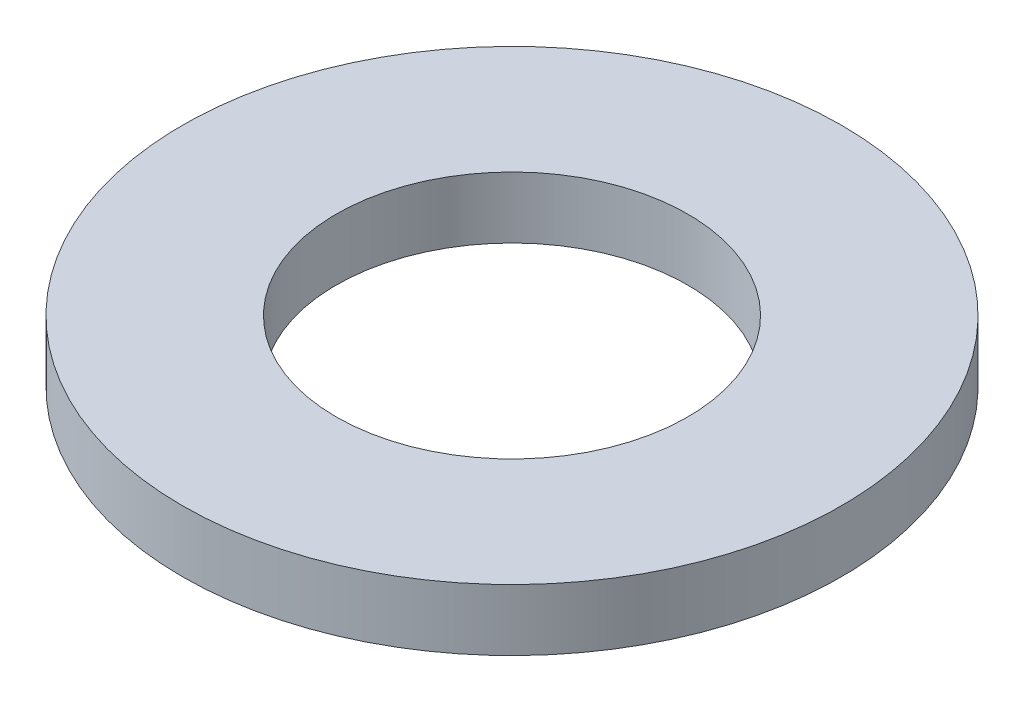
ISO-10303-21;
HEADER;
FILE_DESCRIPTION(('STEP AP214'),'2;1');
FILE_NAME('part.step','',(''),(''),'','','');
FILE_SCHEMA(('AUTOMOTIVE_DESIGN { 1 0 10303 214 1 1 1 1 }'));
ENDSEC;
DATA;
#1=APPLICATION_CONTEXT('core data for automotive mechanical design processes');
#2=APPLICATION_PROTOCOL_DEFINITION('international standard','automotive_design',2000,#1);
#3=PRODUCT_CONTEXT('',#1,'mechanical');
#4=PRODUCT('Part','Part','',(#3));
#5=PRODUCT_RELATED_PRODUCT_CATEGORY('part','',(#4));
#6=PRODUCT_DEFINITION_FORMATION('','',#4);
#7=PRODUCT_DEFINITION_CONTEXT('part definition',#1,'design');
#8=PRODUCT_DEFINITION('design','',#6,#7);
#9=PRODUCT_DEFINITION_SHAPE('','',#8);
#10=(LENGTH_UNIT() NAMED_UNIT(*) SI_UNIT(.MILLI.,.METRE.));
#11=(NAMED_UNIT(*) PLANE_ANGLE_UNIT() SI_UNIT($,.RADIAN.));
#12=(NAMED_UNIT(*) SI_UNIT($,.STERADIAN.) SOLID_ANGLE_UNIT());
#13=UNCERTAINTY_MEASURE_WITH_UNIT(LENGTH_MEASURE(1.E-05),#10,'distance_accuracy_value','');
#14=(GEOMETRIC_REPRESENTATION_CONTEXT(3) GLOBAL_UNCERTAINTY_ASSIGNED_CONTEXT((#13)) GLOBAL_UNIT_ASSIGNED_CONTEXT((#10,
#11,#12)) REPRESENTATION_CONTEXT('',''));
#15=CARTESIAN_POINT('',(0.,0.,0.));
#16=DIRECTION('',(0.,0.,1.));
#17=DIRECTION('',(1.,0.,0.));
#18=AXIS2_PLACEMENT_3D('',#15,#16,#17);
#19=CARTESIAN_POINT('',(0.,1.4,0.));
#20=DIRECTION('',(0.,1.,0.));
#21=DIRECTION('',(0.,0.,1.));
#22=AXIS2_PLACEMENT_3D('',#19,#20,#21);
#23=PLANE('',#22);
#24=CARTESIAN_POINT('',(0.,1.4,0.));
#25=DIRECTION('',(0.,1.,0.));
#26=DIRECTION('',(0.,0.,1.));
#27=AXIS2_PLACEMENT_3D('',#24,#25,#26);
#28=CIRCLE('',#27,7.5);
#29=CARTESIAN_POINT('',(0.,1.4,7.5));
#30=VERTEX_POINT('',#29);
#31=EDGE_CURVE('E10',#30,#30,#28,.T.);
#32=ORIENTED_EDGE('',*,*,#31,.T.);
#33=EDGE_LOOP('',(#32));
#34=FACE_BOUND('',#33,.T.);
#35=CARTESIAN_POINT('',(0.,1.4,0.));
#36=DIRECTION('',(0.,1.,0.));
#37=DIRECTION('',(0.,0.,1.));
#38=AXIS2_PLACEMENT_3D('',#35,#36,#37);
#39=CIRCLE('',#38,4.);
#40=CARTESIAN_POINT('',(0.,1.4,4.));
#41=VERTEX_POINT('',#40);
#42=EDGE_CURVE('E47',#41,#41,#39,.T.);
#43=ORIENTED_EDGE('',*,*,#42,.F.);
#44=EDGE_LOOP('',(#43));
#45=FACE_BOUND('',#44,.T.);
#46=ADVANCED_FACE('F36',(#34,#45),#23,.T.);
#47=CARTESIAN_POINT('',(0.,0.,0.));
#48=DIRECTION('',(0.,1.,0.));
#49=DIRECTION('',(0.,0.,1.));
#50=AXIS2_PLACEMENT_3D('',#47,#48,#49);
#51=PLANE('',#50);
#52=CARTESIAN_POINT('',(0.,0.,0.));
#53=DIRECTION('',(0.,1.,0.));
#54=DIRECTION('',(0.,0.,1.));
#55=AXIS2_PLACEMENT_3D('',#52,#53,#54);
#56=CIRCLE('',#55,7.5);
#57=CARTESIAN_POINT('',(0.,0.,7.5));
#58=VERTEX_POINT('',#57);
#59=EDGE_CURVE('E40',#58,#58,#56,.T.);
#60=ORIENTED_EDGE('',*,*,#59,.F.);
#61=EDGE_LOOP('',(#60));
#62=FACE_BOUND('',#61,.T.);
#63=CARTESIAN_POINT('',(0.,0.,0.));
#64=DIRECTION('',(0.,1.,0.));
#65=DIRECTION('',(0.,0.,1.));
#66=AXIS2_PLACEMENT_3D('',#63,#64,#65);
#67=CIRCLE('',#66,4.);
#68=CARTESIAN_POINT('',(0.,0.,4.));
#69=VERTEX_POINT('',#68);
#70=EDGE_CURVE('E49',#69,#69,#67,.T.);
#71=ORIENTED_EDGE('',*,*,#70,.T.);
#72=EDGE_LOOP('',(#71));
#73=FACE_BOUND('',#72,.T.);
#74=ADVANCED_FACE('F59',(#62,#73),#51,.F.);
#75=CARTESIAN_POINT('',(0.,1.4,0.));
#76=DIRECTION('',(0.,-1.,0.));
#77=DIRECTION('',(0.,0.,-1.));
#78=AXIS2_PLACEMENT_3D('',#75,#76,#77);
#79=CYLINDRICAL_SURFACE('',#78,7.5);
#80=ORIENTED_EDGE('',*,*,#31,.F.);
#81=EDGE_LOOP('',(#80));
#82=FACE_BOUND('',#81,.T.);
#83=ORIENTED_EDGE('',*,*,#59,.T.);
#84=EDGE_LOOP('',(#83));
#85=FACE_BOUND('',#84,.T.);
#86=ADVANCED_FACE('F38',(#82,#85),#79,.T.);
#87=CARTESIAN_POINT('',(0.,1.4,0.));
#88=DIRECTION('',(0.,-1.,0.));
#89=DIRECTION('',(0.,0.,-1.));
#90=AXIS2_PLACEMENT_3D('',#87,#88,#89);
#91=CYLINDRICAL_SURFACE('',#90,4.);
#92=ORIENTED_EDGE('',*,*,#42,.T.);
#93=EDGE_LOOP('',(#92));
#94=FACE_BOUND('',#93,.T.);
#95=ORIENTED_EDGE('',*,*,#70,.F.);
#96=EDGE_LOOP('',(#95));
#97=FACE_BOUND('',#96,.T.);
#98=ADVANCED_FACE('F55',(#94,#97),#91,.F.);
#99=CLOSED_SHELL('',(#46,#74,#86,#98));
#100=MANIFOLD_SOLID_BREP('B2',#99);
#101=ADVANCED_BREP_SHAPE_REPRESENTATION('',(#18,#100),#14);
#102=SHAPE_DEFINITION_REPRESENTATION(#9,#101);
ENDSEC;
END-ISO-10303-21;
